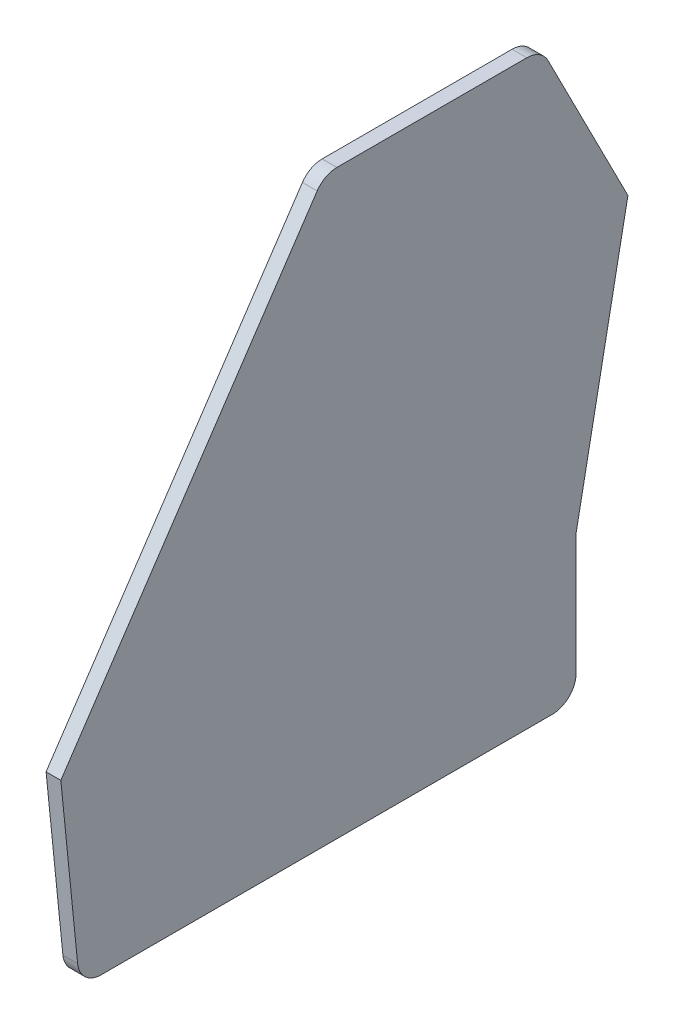
ISO-10303-21;
HEADER;
FILE_DESCRIPTION(('STEP AP214'),'2;1');
FILE_NAME('part.step','',(''),(''),'','','');
FILE_SCHEMA(('AUTOMOTIVE_DESIGN { 1 0 10303 214 1 1 1 1 }'));
ENDSEC;
DATA;
#1=APPLICATION_CONTEXT('core data for automotive mechanical design processes');
#2=APPLICATION_PROTOCOL_DEFINITION('international standard','automotive_design',2000,#1);
#3=PRODUCT_CONTEXT('',#1,'mechanical');
#4=PRODUCT('Part','Part','',(#3));
#5=PRODUCT_RELATED_PRODUCT_CATEGORY('part','',(#4));
#6=PRODUCT_DEFINITION_FORMATION('','',#4);
#7=PRODUCT_DEFINITION_CONTEXT('part definition',#1,'design');
#8=PRODUCT_DEFINITION('design','',#6,#7);
#9=PRODUCT_DEFINITION_SHAPE('','',#8);
#10=(LENGTH_UNIT() NAMED_UNIT(*) SI_UNIT(.MILLI.,.METRE.));
#11=(NAMED_UNIT(*) PLANE_ANGLE_UNIT() SI_UNIT($,.RADIAN.));
#12=(NAMED_UNIT(*) SI_UNIT($,.STERADIAN.) SOLID_ANGLE_UNIT());
#13=UNCERTAINTY_MEASURE_WITH_UNIT(LENGTH_MEASURE(1.E-05),#10,'distance_accuracy_value','');
#14=(GEOMETRIC_REPRESENTATION_CONTEXT(3) GLOBAL_UNCERTAINTY_ASSIGNED_CONTEXT((#13)) GLOBAL_UNIT_ASSIGNED_CONTEXT((#10,
#11,#12)) REPRESENTATION_CONTEXT('',''));
#15=CARTESIAN_POINT('',(0.,0.,0.));
#16=DIRECTION('',(0.,0.,1.));
#17=DIRECTION('',(1.,0.,0.));
#18=AXIS2_PLACEMENT_3D('',#15,#16,#17);
#19=CARTESIAN_POINT('',(1.25984,23.2579142815383,-10.9273442425149));
#20=DIRECTION('',(0.,0.100118709005399,-0.994975499249651));
#21=DIRECTION('',(0.,0.994975499249651,0.100118709005399));
#22=AXIS2_PLACEMENT_3D('',#19,#20,#21);
#23=PLANE('',#22);
#24=DIRECTION('',(0.,-0.994975499249651,-0.100118709005399));
#25=VECTOR('',#24,1.);
#26=CARTESIAN_POINT('',(0.31496,23.2579142815383,-10.9273442425149));
#27=LINE('',#26,#25);
#28=CARTESIAN_POINT('',(0.31496,23.2579142815383,-10.9273442425149));
#29=VERTEX_POINT('',#28);
#30=CARTESIAN_POINT('',(0.31496,12.5357654534476,-12.0062529183986));
#31=VERTEX_POINT('',#30);
#32=EDGE_CURVE('E156',#29,#31,#27,.T.);
#33=ORIENTED_EDGE('',*,*,#32,.T.);
#34=DIRECTION('',(-1.,0.,0.));
#35=VECTOR('',#34,1.);
#36=CARTESIAN_POINT('',(1.25984,12.5357654534476,-12.0062529183986));
#37=LINE('',#36,#35);
#38=CARTESIAN_POINT('',(1.25984,12.5357654534476,-12.0062529183986));
#39=VERTEX_POINT('',#38);
#40=EDGE_CURVE('E180',#31,#39,#37,.F.);
#41=ORIENTED_EDGE('',*,*,#40,.T.);
#42=DIRECTION('',(0.,-0.994975499249651,-0.100118709005399));
#43=VECTOR('',#42,1.);
#44=CARTESIAN_POINT('',(1.25984,23.2579142815383,-10.9273442425149));
#45=LINE('',#44,#43);
#46=CARTESIAN_POINT('',(1.25984,23.2579142815383,-10.9273442425149));
#47=VERTEX_POINT('',#46);
#48=EDGE_CURVE('E172',#47,#39,#45,.T.);
#49=ORIENTED_EDGE('',*,*,#48,.F.);
#50=DIRECTION('',(-1.,0.,0.));
#51=VECTOR('',#50,1.);
#52=CARTESIAN_POINT('',(1.25984,23.2579142815383,-10.9273442425149));
#53=LINE('',#52,#51);
#54=EDGE_CURVE('E155',#47,#29,#53,.T.);
#55=ORIENTED_EDGE('',*,*,#54,.T.);
#56=EDGE_LOOP('',(#33,#41,#49,#55));
#57=FACE_BOUND('',#56,.T.);
#58=ADVANCED_FACE('F35',(#57),#23,.F.);
#59=CARTESIAN_POINT('',(1.25984,11.1643463659719,-12.1442509983986));
#60=DIRECTION('',(0.,1.,0.));
#61=DIRECTION('',(0.,0.,1.));
#62=AXIS2_PLACEMENT_3D('',#59,#60,#61);
#63=PLANE('',#62);
#64=DIRECTION('',(0.,0.,-1.));
#65=VECTOR('',#64,1.);
#66=CARTESIAN_POINT('',(0.31496,11.1643463659719,-12.1442509983986));
#67=LINE('',#66,#65);
#68=CARTESIAN_POINT('',(0.31496,11.1643463659719,-13.5225955792551));
#69=VERTEX_POINT('',#68);
#70=CARTESIAN_POINT('',(0.31496,11.1643463659719,-42.4413709983986));
#71=VERTEX_POINT('',#70);
#72=EDGE_CURVE('E159',#69,#71,#67,.T.);
#73=ORIENTED_EDGE('',*,*,#72,.T.);
#74=DIRECTION('',(-1.,0.,0.));
#75=VECTOR('',#74,1.);
#76=CARTESIAN_POINT('',(1.25984,11.1643463659719,-42.4413709983986));
#77=LINE('',#76,#75);
#78=CARTESIAN_POINT('',(1.25984,11.1643463659719,-42.4413709983986));
#79=VERTEX_POINT('',#78);
#80=EDGE_CURVE('E192',#71,#79,#77,.F.);
#81=ORIENTED_EDGE('',*,*,#80,.T.);
#82=DIRECTION('',(0.,0.,-1.));
#83=VECTOR('',#82,1.);
#84=CARTESIAN_POINT('',(1.25984,11.1643463659719,-12.1442509983986));
#85=LINE('',#84,#83);
#86=CARTESIAN_POINT('',(1.25984,11.1643463659719,-13.5225955792551));
#87=VERTEX_POINT('',#86);
#88=EDGE_CURVE('E131',#87,#79,#85,.T.);
#89=ORIENTED_EDGE('',*,*,#88,.F.);
#90=DIRECTION('',(-1.,0.,0.));
#91=VECTOR('',#90,1.);
#92=CARTESIAN_POINT('',(1.25984,11.1643463659719,-13.5225955792551));
#93=LINE('',#92,#91);
#94=EDGE_CURVE('E140',#87,#69,#93,.T.);
#95=ORIENTED_EDGE('',*,*,#94,.T.);
#96=EDGE_LOOP('',(#73,#81,#89,#95));
#97=FACE_BOUND('',#96,.T.);
#98=ADVANCED_FACE('F232',(#97),#63,.F.);
#99=CARTESIAN_POINT('',(1.25984,11.1643463659719,-43.9653709983986));
#100=DIRECTION('',(0.,0.,1.));
#101=DIRECTION('',(1.,0.,0.));
#102=AXIS2_PLACEMENT_3D('',#99,#100,#101);
#103=PLANE('',#102);
#104=DIRECTION('',(0.,1.,0.));
#105=VECTOR('',#104,1.);
#106=CARTESIAN_POINT('',(1.25984,11.1643463659719,-43.9653709983986));
#107=LINE('',#106,#105);
#108=CARTESIAN_POINT('',(1.25984,12.6883463659719,-43.9653709983986));
#109=VERTEX_POINT('',#108);
#110=CARTESIAN_POINT('',(1.25984,20.4637943659718,-43.9653709983986));
#111=VERTEX_POINT('',#110);
#112=EDGE_CURVE('E118',#109,#111,#107,.T.);
#113=ORIENTED_EDGE('',*,*,#112,.F.);
#114=DIRECTION('',(-1.,0.,0.));
#115=VECTOR('',#114,1.);
#116=CARTESIAN_POINT('',(1.25984,12.6883463659719,-43.9653709983986));
#117=LINE('',#116,#115);
#118=CARTESIAN_POINT('',(0.31496,12.6883463659719,-43.9653709983986));
#119=VERTEX_POINT('',#118);
#120=EDGE_CURVE('E184',#109,#119,#117,.T.);
#121=ORIENTED_EDGE('',*,*,#120,.T.);
#122=DIRECTION('',(0.,1.,0.));
#123=VECTOR('',#122,1.);
#124=CARTESIAN_POINT('',(0.31496,11.1643463659719,-43.9653709983986));
#125=LINE('',#124,#123);
#126=CARTESIAN_POINT('',(0.31496,20.4637943659718,-43.9653709983986));
#127=VERTEX_POINT('',#126);
#128=EDGE_CURVE('E137',#119,#127,#125,.T.);
#129=ORIENTED_EDGE('',*,*,#128,.T.);
#130=DIRECTION('',(-1.,0.,0.));
#131=VECTOR('',#130,1.);
#132=CARTESIAN_POINT('',(1.25984,20.4637943659718,-43.9653709983986));
#133=LINE('',#132,#131);
#134=EDGE_CURVE('E134',#111,#127,#133,.T.);
#135=ORIENTED_EDGE('',*,*,#134,.F.);
#136=EDGE_LOOP('',(#113,#121,#129,#135));
#137=FACE_BOUND('',#136,.T.);
#138=ADVANCED_FACE('F135',(#137),#103,.F.);
#139=CARTESIAN_POINT('',(1.25984,20.4637943659718,-43.9653709983986));
#140=DIRECTION('',(0.,0.190808995376548,0.981627183447663));
#141=DIRECTION('',(0.,-0.981627183447663,0.190808995376548));
#142=AXIS2_PLACEMENT_3D('',#139,#140,#141);
#143=PLANE('',#142);
#144=DIRECTION('',(0.,0.981627183447663,-0.190808995376548));
#145=VECTOR('',#144,1.);
#146=CARTESIAN_POINT('',(0.31496,20.4637943659718,-43.9653709983986));
#147=LINE('',#146,#145);
#148=CARTESIAN_POINT('',(0.31496,37.5556490643099,-47.2876909983986));
#149=VERTEX_POINT('',#148);
#150=EDGE_CURVE('E163',#127,#149,#147,.T.);
#151=ORIENTED_EDGE('',*,*,#150,.T.);
#152=DIRECTION('',(-1.,0.,0.));
#153=VECTOR('',#152,1.);
#154=CARTESIAN_POINT('',(1.25984,37.5556490643099,-47.2876909983986));
#155=LINE('',#154,#153);
#156=CARTESIAN_POINT('',(1.25984,37.5556490643099,-47.2876909983986));
#157=VERTEX_POINT('',#156);
#158=EDGE_CURVE('E141',#157,#149,#155,.T.);
#159=ORIENTED_EDGE('',*,*,#158,.F.);
#160=DIRECTION('',(0.,0.981627183447663,-0.190808995376548));
#161=VECTOR('',#160,1.);
#162=CARTESIAN_POINT('',(1.25984,20.4637943659718,-43.9653709983986));
#163=LINE('',#162,#161);
#164=EDGE_CURVE('E124',#111,#157,#163,.T.);
#165=ORIENTED_EDGE('',*,*,#164,.F.);
#166=ORIENTED_EDGE('',*,*,#134,.T.);
#167=EDGE_LOOP('',(#151,#159,#165,#166));
#168=FACE_BOUND('',#167,.T.);
#169=ADVANCED_FACE('F143',(#168),#143,.F.);
#170=CARTESIAN_POINT('',(1.25984,37.5556490643099,-47.2876909983986));
#171=DIRECTION('',(0.,-0.453990499739546,0.891006524188369));
#172=DIRECTION('',(0.,-0.891006524188369,-0.453990499739546));
#173=AXIS2_PLACEMENT_3D('',#170,#171,#172);
#174=PLANE('',#173);
#175=DIRECTION('',(0.,0.891006524188368,0.453990499739546));
#176=VECTOR('',#175,1.);
#177=CARTESIAN_POINT('',(0.31496,37.5556490643099,-47.2876909983986));
#178=LINE('',#177,#176);
#179=CARTESIAN_POINT('',(0.31496,47.6092678875749,-42.1651163484289));
#180=VERTEX_POINT('',#179);
#181=EDGE_CURVE('E165',#149,#180,#178,.T.);
#182=ORIENTED_EDGE('',*,*,#181,.T.);
#183=DIRECTION('',(-1.,0.,0.));
#184=VECTOR('',#183,1.);
#185=CARTESIAN_POINT('',(1.25984,47.6092678875749,-42.1651163484289));
#186=LINE('',#185,#184);
#187=CARTESIAN_POINT('',(1.25984,47.6092678875749,-42.1651163484289));
#188=VERTEX_POINT('',#187);
#189=EDGE_CURVE('E43',#180,#188,#186,.F.);
#190=ORIENTED_EDGE('',*,*,#189,.T.);
#191=DIRECTION('',(0.,0.891006524188368,0.453990499739546));
#192=VECTOR('',#191,1.);
#193=CARTESIAN_POINT('',(1.25984,37.5556490643099,-47.2876909983986));
#194=LINE('',#193,#192);
#195=EDGE_CURVE('E146',#157,#188,#194,.T.);
#196=ORIENTED_EDGE('',*,*,#195,.F.);
#197=ORIENTED_EDGE('',*,*,#158,.T.);
#198=EDGE_LOOP('',(#182,#190,#196,#197));
#199=FACE_BOUND('',#198,.T.);
#200=ADVANCED_FACE('F203',(#199),#174,.F.);
#201=CARTESIAN_POINT('',(1.25984,48.4413863659718,-41.741130806691));
#202=DIRECTION('',(0.,-1.,0.));
#203=DIRECTION('',(0.,0.,-1.));
#204=AXIS2_PLACEMENT_3D('',#201,#202,#203);
#205=PLANE('',#204);
#206=DIRECTION('',(0.,0.,1.));
#207=VECTOR('',#206,1.);
#208=CARTESIAN_POINT('',(1.25984,48.4413863659718,-41.741130806691));
#209=LINE('',#208,#207);
#210=CARTESIAN_POINT('',(1.25984,48.4413863659718,-40.8072224055658));
#211=VERTEX_POINT('',#210);
#212=CARTESIAN_POINT('',(1.25984,48.4413863659718,-28.6285790905244));
#213=VERTEX_POINT('',#212);
#214=EDGE_CURVE('E148',#211,#213,#209,.T.);
#215=ORIENTED_EDGE('',*,*,#214,.F.);
#216=DIRECTION('',(-1.,0.,0.));
#217=VECTOR('',#216,1.);
#218=CARTESIAN_POINT('',(1.25984,48.4413863659718,-40.8072224055658));
#219=LINE('',#218,#217);
#220=CARTESIAN_POINT('',(0.31496,48.4413863659718,-40.8072224055658));
#221=VERTEX_POINT('',#220);
#222=EDGE_CURVE('E199',#211,#221,#219,.T.);
#223=ORIENTED_EDGE('',*,*,#222,.T.);
#224=DIRECTION('',(0.,0.,1.));
#225=VECTOR('',#224,1.);
#226=CARTESIAN_POINT('',(0.31496,48.4413863659718,-41.741130806691));
#227=LINE('',#226,#225);
#228=CARTESIAN_POINT('',(0.31496,48.4413863659718,-28.6285790905244));
#229=VERTEX_POINT('',#228);
#230=EDGE_CURVE('E168',#221,#229,#227,.T.);
#231=ORIENTED_EDGE('',*,*,#230,.T.);
#232=DIRECTION('',(-1.,0.,0.));
#233=VECTOR('',#232,1.);
#234=CARTESIAN_POINT('',(1.25984,48.4413863659718,-28.6285790905244));
#235=LINE('',#234,#233);
#236=EDGE_CURVE('E58',#229,#213,#235,.F.);
#237=ORIENTED_EDGE('',*,*,#236,.T.);
#238=EDGE_LOOP('',(#215,#223,#231,#237));
#239=FACE_BOUND('',#238,.T.);
#240=ADVANCED_FACE('F210',(#239),#205,.F.);
#241=CARTESIAN_POINT('',(1.25984,48.4413863659718,-27.8156282071302));
#242=DIRECTION('',(0.,-0.55696540226723,-0.830535695004918));
#243=DIRECTION('',(0.,0.830535695004918,-0.55696540226723));
#244=AXIS2_PLACEMENT_3D('',#241,#242,#243);
#245=PLANE('',#244);
#246=DIRECTION('',(0.,-0.830535695004918,0.55696540226723));
#247=VECTOR('',#246,1.);
#248=CARTESIAN_POINT('',(1.25984,48.4413863659718,-27.8156282071302));
#249=LINE('',#248,#247);
#250=CARTESIAN_POINT('',(1.25984,47.7662016390271,-27.362842691337));
#251=VERTEX_POINT('',#250);
#252=EDGE_CURVE('E153',#251,#47,#249,.T.);
#253=ORIENTED_EDGE('',*,*,#252,.F.);
#254=DIRECTION('',(-1.,0.,0.));
#255=VECTOR('',#254,1.);
#256=CARTESIAN_POINT('',(1.25984,47.7662016390271,-27.362842691337));
#257=LINE('',#256,#255);
#258=CARTESIAN_POINT('',(0.31496,47.7662016390271,-27.362842691337));
#259=VERTEX_POINT('',#258);
#260=EDGE_CURVE('E11',#251,#259,#257,.T.);
#261=ORIENTED_EDGE('',*,*,#260,.T.);
#262=DIRECTION('',(0.,-0.830535695004918,0.55696540226723));
#263=VECTOR('',#262,1.);
#264=CARTESIAN_POINT('',(0.31496,48.4413863659718,-27.8156282071302));
#265=LINE('',#264,#263);
#266=EDGE_CURVE('E170',#259,#29,#265,.T.);
#267=ORIENTED_EDGE('',*,*,#266,.T.);
#268=ORIENTED_EDGE('',*,*,#54,.F.);
#269=EDGE_LOOP('',(#253,#261,#267,#268));
#270=FACE_BOUND('',#269,.T.);
#271=ADVANCED_FACE('F218',(#270),#245,.F.);
#272=CARTESIAN_POINT('',(1.25984,11.1643463659719,-12.1442509983986));
#273=DIRECTION('',(1.,0.,0.));
#274=DIRECTION('',(0.,0.,-1.));
#275=AXIS2_PLACEMENT_3D('',#272,#273,#274);
#276=PLANE('',#275);
#277=ORIENTED_EDGE('',*,*,#88,.T.);
#278=CARTESIAN_POINT('',(1.25984,12.6883463659719,-42.4413709983986));
#279=DIRECTION('',(1.,0.,0.));
#280=DIRECTION('',(0.,0.,-1.));
#281=AXIS2_PLACEMENT_3D('',#278,#279,#280);
#282=CIRCLE('',#281,1.524);
#283=EDGE_CURVE('E127',#79,#109,#282,.T.);
#284=ORIENTED_EDGE('',*,*,#283,.T.);
#285=ORIENTED_EDGE('',*,*,#112,.T.);
#286=ORIENTED_EDGE('',*,*,#164,.T.);
#287=ORIENTED_EDGE('',*,*,#195,.T.);
#288=CARTESIAN_POINT('',(1.25984,46.9173863659719,-40.8072224055658));
#289=DIRECTION('',(1.,0.,0.));
#290=DIRECTION('',(0.,0.,-1.));
#291=AXIS2_PLACEMENT_3D('',#288,#289,#290);
#292=CIRCLE('',#291,1.524);
#293=EDGE_CURVE('E195',#188,#211,#292,.T.);
#294=ORIENTED_EDGE('',*,*,#293,.T.);
#295=ORIENTED_EDGE('',*,*,#214,.T.);
#296=CARTESIAN_POINT('',(1.25984,46.9173863659719,-28.6285790905244));
#297=DIRECTION('',(1.,0.,0.));
#298=DIRECTION('',(0.,0.,-1.));
#299=AXIS2_PLACEMENT_3D('',#296,#297,#298);
#300=CIRCLE('',#299,1.524);
#301=EDGE_CURVE('E50',#213,#251,#300,.T.);
#302=ORIENTED_EDGE('',*,*,#301,.T.);
#303=ORIENTED_EDGE('',*,*,#252,.T.);
#304=ORIENTED_EDGE('',*,*,#48,.T.);
#305=CARTESIAN_POINT('',(1.25984,12.6883463659719,-13.5225955792551));
#306=DIRECTION('',(1.,0.,0.));
#307=DIRECTION('',(0.,0.,-1.));
#308=AXIS2_PLACEMENT_3D('',#305,#306,#307);
#309=CIRCLE('',#308,1.524);
#310=EDGE_CURVE('E182',#39,#87,#309,.T.);
#311=ORIENTED_EDGE('',*,*,#310,.T.);
#312=EDGE_LOOP('',(#277,#284,#285,#286,#287,#294,#295,#302,#303,#304,#311));
#313=FACE_BOUND('',#312,.T.);
#314=ADVANCED_FACE('F121',(#313),#276,.T.);
#315=CARTESIAN_POINT('',(0.31496,11.1643463659719,-12.1442509983986));
#316=DIRECTION('',(1.,0.,0.));
#317=DIRECTION('',(0.,0.,-1.));
#318=AXIS2_PLACEMENT_3D('',#315,#316,#317);
#319=PLANE('',#318);
#320=ORIENTED_EDGE('',*,*,#128,.F.);
#321=CARTESIAN_POINT('',(0.31496,12.6883463659719,-42.4413709983986));
#322=DIRECTION('',(1.,0.,0.));
#323=DIRECTION('',(0.,0.,-1.));
#324=AXIS2_PLACEMENT_3D('',#321,#322,#323);
#325=CIRCLE('',#324,1.524);
#326=EDGE_CURVE('E190',#119,#71,#325,.F.);
#327=ORIENTED_EDGE('',*,*,#326,.T.);
#328=ORIENTED_EDGE('',*,*,#72,.F.);
#329=CARTESIAN_POINT('',(0.31496,12.6883463659719,-13.5225955792551));
#330=DIRECTION('',(1.,0.,0.));
#331=DIRECTION('',(0.,0.,-1.));
#332=AXIS2_PLACEMENT_3D('',#329,#330,#331);
#333=CIRCLE('',#332,1.524);
#334=EDGE_CURVE('E178',#69,#31,#333,.F.);
#335=ORIENTED_EDGE('',*,*,#334,.T.);
#336=ORIENTED_EDGE('',*,*,#32,.F.);
#337=ORIENTED_EDGE('',*,*,#266,.F.);
#338=CARTESIAN_POINT('',(0.31496,46.9173863659719,-28.6285790905244));
#339=DIRECTION('',(1.,0.,0.));
#340=DIRECTION('',(0.,0.,-1.));
#341=AXIS2_PLACEMENT_3D('',#338,#339,#340);
#342=CIRCLE('',#341,1.524);
#343=EDGE_CURVE('E186',#259,#229,#342,.F.);
#344=ORIENTED_EDGE('',*,*,#343,.T.);
#345=ORIENTED_EDGE('',*,*,#230,.F.);
#346=CARTESIAN_POINT('',(0.31496,46.9173863659719,-40.8072224055658));
#347=DIRECTION('',(1.,0.,0.));
#348=DIRECTION('',(0.,0.,-1.));
#349=AXIS2_PLACEMENT_3D('',#346,#347,#348);
#350=CIRCLE('',#349,1.524);
#351=EDGE_CURVE('E188',#221,#180,#350,.F.);
#352=ORIENTED_EDGE('',*,*,#351,.T.);
#353=ORIENTED_EDGE('',*,*,#181,.F.);
#354=ORIENTED_EDGE('',*,*,#150,.F.);
#355=EDGE_LOOP('',(#320,#327,#328,#335,#336,#337,#344,#345,#352,#353,#354));
#356=FACE_BOUND('',#355,.T.);
#357=ADVANCED_FACE('F212',(#356),#319,.F.);
#358=CARTESIAN_POINT('',(1.25984,12.6883463659719,-13.5225955792551));
#359=DIRECTION('',(-1.,0.,0.));
#360=DIRECTION('',(0.,0.,1.));
#361=AXIS2_PLACEMENT_3D('',#358,#359,#360);
#362=CYLINDRICAL_SURFACE('',#361,1.524);
#363=ORIENTED_EDGE('',*,*,#310,.F.);
#364=ORIENTED_EDGE('',*,*,#40,.F.);
#365=ORIENTED_EDGE('',*,*,#334,.F.);
#366=ORIENTED_EDGE('',*,*,#94,.F.);
#367=EDGE_LOOP('',(#363,#364,#365,#366));
#368=FACE_BOUND('',#367,.T.);
#369=ADVANCED_FACE('F229',(#368),#362,.T.);
#370=CARTESIAN_POINT('',(1.25984,12.6883463659719,-42.4413709983986));
#371=DIRECTION('',(-1.,0.,0.));
#372=DIRECTION('',(0.,0.,1.));
#373=AXIS2_PLACEMENT_3D('',#370,#371,#372);
#374=CYLINDRICAL_SURFACE('',#373,1.524);
#375=ORIENTED_EDGE('',*,*,#283,.F.);
#376=ORIENTED_EDGE('',*,*,#80,.F.);
#377=ORIENTED_EDGE('',*,*,#326,.F.);
#378=ORIENTED_EDGE('',*,*,#120,.F.);
#379=EDGE_LOOP('',(#375,#376,#377,#378));
#380=FACE_BOUND('',#379,.T.);
#381=ADVANCED_FACE('F235',(#380),#374,.T.);
#382=CARTESIAN_POINT('',(1.25984,46.9173863659719,-40.8072224055658));
#383=DIRECTION('',(-1.,0.,0.));
#384=DIRECTION('',(0.,0.,1.));
#385=AXIS2_PLACEMENT_3D('',#382,#383,#384);
#386=CYLINDRICAL_SURFACE('',#385,1.524);
#387=ORIENTED_EDGE('',*,*,#293,.F.);
#388=ORIENTED_EDGE('',*,*,#189,.F.);
#389=ORIENTED_EDGE('',*,*,#351,.F.);
#390=ORIENTED_EDGE('',*,*,#222,.F.);
#391=EDGE_LOOP('',(#387,#388,#389,#390));
#392=FACE_BOUND('',#391,.T.);
#393=ADVANCED_FACE('F208',(#392),#386,.T.);
#394=CARTESIAN_POINT('',(1.25984,46.9173863659719,-28.6285790905244));
#395=DIRECTION('',(-1.,0.,0.));
#396=DIRECTION('',(0.,0.,1.));
#397=AXIS2_PLACEMENT_3D('',#394,#395,#396);
#398=CYLINDRICAL_SURFACE('',#397,1.524);
#399=ORIENTED_EDGE('',*,*,#301,.F.);
#400=ORIENTED_EDGE('',*,*,#236,.F.);
#401=ORIENTED_EDGE('',*,*,#343,.F.);
#402=ORIENTED_EDGE('',*,*,#260,.F.);
#403=EDGE_LOOP('',(#399,#400,#401,#402));
#404=FACE_BOUND('',#403,.T.);
#405=ADVANCED_FACE('F37',(#404),#398,.T.);
#406=CLOSED_SHELL('',(#58,#98,#138,#169,#200,#240,#271,#314,#357,#369,#381,#393,#405));
#407=MANIFOLD_SOLID_BREP('B2',#406);
#408=ADVANCED_BREP_SHAPE_REPRESENTATION('',(#18,#407),#14);
#409=SHAPE_DEFINITION_REPRESENTATION(#9,#408);
ENDSEC;
END-ISO-10303-21;
